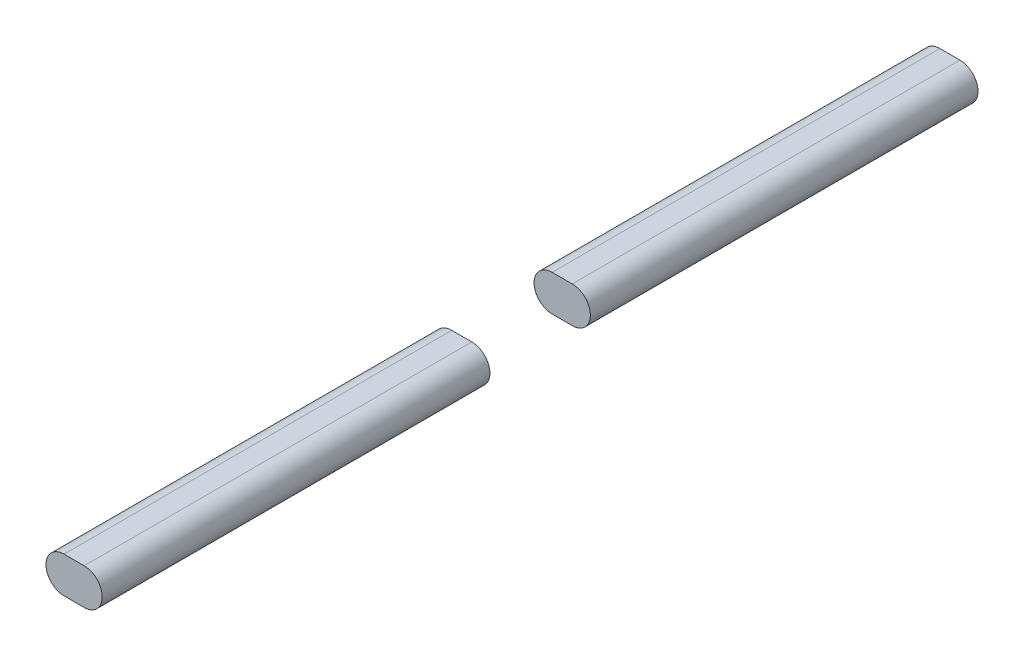
ISO-10303-21;
HEADER;
FILE_DESCRIPTION(('STEP AP214'),'2;1');
FILE_NAME('part.step','',(''),(''),'','','');
FILE_SCHEMA(('AUTOMOTIVE_DESIGN { 1 0 10303 214 1 1 1 1 }'));
ENDSEC;
DATA;
#1=APPLICATION_CONTEXT('core data for automotive mechanical design processes');
#2=APPLICATION_PROTOCOL_DEFINITION('international standard','automotive_design',2000,#1);
#3=PRODUCT_CONTEXT('',#1,'mechanical');
#4=PRODUCT('Part','Part','',(#3));
#5=PRODUCT_RELATED_PRODUCT_CATEGORY('part','',(#4));
#6=PRODUCT_DEFINITION_FORMATION('','',#4);
#7=PRODUCT_DEFINITION_CONTEXT('part definition',#1,'design');
#8=PRODUCT_DEFINITION('design','',#6,#7);
#9=PRODUCT_DEFINITION_SHAPE('','',#8);
#10=(LENGTH_UNIT() NAMED_UNIT(*) SI_UNIT(.MILLI.,.METRE.));
#11=(NAMED_UNIT(*) PLANE_ANGLE_UNIT() SI_UNIT($,.RADIAN.));
#12=(NAMED_UNIT(*) SI_UNIT($,.STERADIAN.) SOLID_ANGLE_UNIT());
#13=UNCERTAINTY_MEASURE_WITH_UNIT(LENGTH_MEASURE(1.E-05),#10,'distance_accuracy_value','');
#14=(GEOMETRIC_REPRESENTATION_CONTEXT(3) GLOBAL_UNCERTAINTY_ASSIGNED_CONTEXT((#13)) GLOBAL_UNIT_ASSIGNED_CONTEXT((#10,
#11,#12)) REPRESENTATION_CONTEXT('',''));
#15=CARTESIAN_POINT('',(0.,0.,0.));
#16=DIRECTION('',(0.,0.,1.));
#17=DIRECTION('',(1.,0.,0.));
#18=AXIS2_PLACEMENT_3D('',#15,#16,#17);
#19=CARTESIAN_POINT('',(-22.75,-4.5,12.5));
#20=DIRECTION('',(0.,0.,1.));
#21=DIRECTION('',(1.,0.,0.));
#22=AXIS2_PLACEMENT_3D('',#19,#20,#21);
#23=PLANE('',#22);
#24=DIRECTION('',(1.,0.,0.));
#25=VECTOR('',#24,1.);
#26=CARTESIAN_POINT('',(-25.25,0.,12.5));
#27=LINE('',#26,#25);
#28=CARTESIAN_POINT('',(-27.75,0.,12.5));
#29=VERTEX_POINT('',#28);
#30=CARTESIAN_POINT('',(-22.75,0.,12.5));
#31=VERTEX_POINT('',#30);
#32=EDGE_CURVE('E87',#29,#31,#27,.T.);
#33=ORIENTED_EDGE('',*,*,#32,.T.);
#34=CARTESIAN_POINT('',(-22.75,-4.5,12.5));
#35=DIRECTION('',(0.,0.,1.));
#36=DIRECTION('',(1.,0.,0.));
#37=AXIS2_PLACEMENT_3D('',#34,#35,#36);
#38=CIRCLE('',#37,4.5);
#39=CARTESIAN_POINT('',(-22.75,-9.,12.5));
#40=VERTEX_POINT('',#39);
#41=EDGE_CURVE('E93',#40,#31,#38,.T.);
#42=ORIENTED_EDGE('',*,*,#41,.F.);
#43=DIRECTION('',(-1.,0.,0.));
#44=VECTOR('',#43,1.);
#45=CARTESIAN_POINT('',(-25.25,-9.,12.5));
#46=LINE('',#45,#44);
#47=CARTESIAN_POINT('',(-27.75,-9.,12.5));
#48=VERTEX_POINT('',#47);
#49=EDGE_CURVE('E99',#40,#48,#46,.T.);
#50=ORIENTED_EDGE('',*,*,#49,.T.);
#51=CARTESIAN_POINT('',(-27.75,-4.5,12.5));
#52=DIRECTION('',(0.,0.,1.));
#53=DIRECTION('',(1.,0.,0.));
#54=AXIS2_PLACEMENT_3D('',#51,#52,#53);
#55=CIRCLE('',#54,4.5);
#56=EDGE_CURVE('E91',#29,#48,#55,.T.);
#57=ORIENTED_EDGE('',*,*,#56,.F.);
#58=EDGE_LOOP('',(#33,#42,#50,#57));
#59=FACE_BOUND('',#58,.T.);
#60=ADVANCED_FACE('F45',(#59),#23,.F.);
#61=CARTESIAN_POINT('',(-22.75,-4.5,125.643316977093));
#62=DIRECTION('',(0.,0.,-1.));
#63=DIRECTION('',(-1.,0.,0.));
#64=AXIS2_PLACEMENT_3D('',#61,#62,#63);
#65=CYLINDRICAL_SURFACE('',#64,4.5);
#66=DIRECTION('',(0.,0.,-1.));
#67=VECTOR('',#66,1.);
#68=CARTESIAN_POINT('',(-22.75,0.,125.643316977093));
#69=LINE('',#68,#67);
#70=CARTESIAN_POINT('',(-22.75,0.,109.));
#71=VERTEX_POINT('',#70);
#72=EDGE_CURVE('E84',#71,#31,#69,.T.);
#73=ORIENTED_EDGE('',*,*,#72,.F.);
#74=CARTESIAN_POINT('',(-22.75,-4.5,109.));
#75=DIRECTION('',(0.,0.,-1.));
#76=DIRECTION('',(-1.,0.,0.));
#77=AXIS2_PLACEMENT_3D('',#74,#75,#76);
#78=CIRCLE('',#77,4.5);
#79=CARTESIAN_POINT('',(-22.75,-9.,109.));
#80=VERTEX_POINT('',#79);
#81=EDGE_CURVE('E49',#71,#80,#78,.T.);
#82=ORIENTED_EDGE('',*,*,#81,.T.);
#83=DIRECTION('',(0.,0.,-1.));
#84=VECTOR('',#83,1.);
#85=CARTESIAN_POINT('',(-22.75,-9.,125.643316977093));
#86=LINE('',#85,#84);
#87=EDGE_CURVE('E90',#80,#40,#86,.T.);
#88=ORIENTED_EDGE('',*,*,#87,.T.);
#89=ORIENTED_EDGE('',*,*,#41,.T.);
#90=EDGE_LOOP('',(#73,#82,#88,#89));
#91=FACE_BOUND('',#90,.T.);
#92=ADVANCED_FACE('F94',(#91),#65,.T.);
#93=CARTESIAN_POINT('',(-25.25,-9.,125.643316977093));
#94=DIRECTION('',(0.,-1.,0.));
#95=DIRECTION('',(1.,0.,0.));
#96=AXIS2_PLACEMENT_3D('',#93,#94,#95);
#97=PLANE('',#96);
#98=DIRECTION('',(1.,0.,0.));
#99=VECTOR('',#98,1.);
#100=CARTESIAN_POINT('',(-25.25,-9.,109.));
#101=LINE('',#100,#99);
#102=CARTESIAN_POINT('',(-27.75,-9.,109.));
#103=VERTEX_POINT('',#102);
#104=EDGE_CURVE('E115',#103,#80,#101,.T.);
#105=ORIENTED_EDGE('',*,*,#104,.F.);
#106=DIRECTION('',(0.,0.,-1.));
#107=VECTOR('',#106,1.);
#108=CARTESIAN_POINT('',(-27.75,-9.,125.643316977093));
#109=LINE('',#108,#107);
#110=EDGE_CURVE('E110',#103,#48,#109,.T.);
#111=ORIENTED_EDGE('',*,*,#110,.T.);
#112=ORIENTED_EDGE('',*,*,#49,.F.);
#113=ORIENTED_EDGE('',*,*,#87,.F.);
#114=EDGE_LOOP('',(#105,#111,#112,#113));
#115=FACE_BOUND('',#114,.T.);
#116=ADVANCED_FACE('F114',(#115),#97,.T.);
#117=CARTESIAN_POINT('',(-27.75,-4.5,125.643316977093));
#118=DIRECTION('',(0.,0.,-1.));
#119=DIRECTION('',(-1.,0.,0.));
#120=AXIS2_PLACEMENT_3D('',#117,#118,#119);
#121=CYLINDRICAL_SURFACE('',#120,4.5);
#122=ORIENTED_EDGE('',*,*,#110,.F.);
#123=CARTESIAN_POINT('',(-27.75,-4.5,109.));
#124=DIRECTION('',(0.,0.,-1.));
#125=DIRECTION('',(-1.,0.,0.));
#126=AXIS2_PLACEMENT_3D('',#123,#124,#125);
#127=CIRCLE('',#126,4.5);
#128=CARTESIAN_POINT('',(-27.75,0.,109.));
#129=VERTEX_POINT('',#128);
#130=EDGE_CURVE('E54',#103,#129,#127,.T.);
#131=ORIENTED_EDGE('',*,*,#130,.T.);
#132=DIRECTION('',(0.,0.,-1.));
#133=VECTOR('',#132,1.);
#134=CARTESIAN_POINT('',(-27.75,0.,125.643316977093));
#135=LINE('',#134,#133);
#136=EDGE_CURVE('E108',#129,#29,#135,.T.);
#137=ORIENTED_EDGE('',*,*,#136,.T.);
#138=ORIENTED_EDGE('',*,*,#56,.T.);
#139=EDGE_LOOP('',(#122,#131,#137,#138));
#140=FACE_BOUND('',#139,.T.);
#141=ADVANCED_FACE('F117',(#140),#121,.T.);
#142=CARTESIAN_POINT('',(-25.25,0.,125.643316977093));
#143=DIRECTION('',(0.,1.,0.));
#144=DIRECTION('',(-1.,0.,0.));
#145=AXIS2_PLACEMENT_3D('',#142,#143,#144);
#146=PLANE('',#145);
#147=DIRECTION('',(-1.,0.,0.));
#148=VECTOR('',#147,1.);
#149=CARTESIAN_POINT('',(-25.25,0.,109.));
#150=LINE('',#149,#148);
#151=EDGE_CURVE('E12',#71,#129,#150,.T.);
#152=ORIENTED_EDGE('',*,*,#151,.F.);
#153=ORIENTED_EDGE('',*,*,#72,.T.);
#154=ORIENTED_EDGE('',*,*,#32,.F.);
#155=ORIENTED_EDGE('',*,*,#136,.F.);
#156=EDGE_LOOP('',(#152,#153,#154,#155));
#157=FACE_BOUND('',#156,.T.);
#158=ADVANCED_FACE('F47',(#157),#146,.T.);
#159=CARTESIAN_POINT('',(0.,-7.08333333333333,109.));
#160=DIRECTION('',(0.,0.,-1.));
#161=DIRECTION('',(-1.,0.,0.));
#162=AXIS2_PLACEMENT_3D('',#159,#160,#161);
#163=PLANE('',#162);
#164=ORIENTED_EDGE('',*,*,#151,.T.);
#165=ORIENTED_EDGE('',*,*,#130,.F.);
#166=ORIENTED_EDGE('',*,*,#104,.T.);
#167=ORIENTED_EDGE('',*,*,#81,.F.);
#168=EDGE_LOOP('',(#164,#165,#166,#167));
#169=FACE_BOUND('',#168,.T.);
#170=ADVANCED_FACE('F119',(#169),#163,.F.);
#171=CLOSED_SHELL('',(#60,#92,#116,#141,#158,#170));
#172=MANIFOLD_SOLID_BREP('B2',#171);
#173=CARTESIAN_POINT('',(-22.75,-4.5,-125.643316977093));
#174=DIRECTION('',(0.,0.,1.));
#175=DIRECTION('',(1.,0.,0.));
#176=AXIS2_PLACEMENT_3D('',#173,#174,#175);
#177=CYLINDRICAL_SURFACE('',#176,4.5);
#178=CARTESIAN_POINT('',(-22.75,-4.5,-109.));
#179=DIRECTION('',(0.,0.,-1.));
#180=DIRECTION('',(-1.,0.,0.));
#181=AXIS2_PLACEMENT_3D('',#178,#179,#180);
#182=CIRCLE('',#181,4.5);
#183=CARTESIAN_POINT('',(-22.75,0.,-109.));
#184=VERTEX_POINT('',#183);
#185=CARTESIAN_POINT('',(-22.75,-9.,-109.));
#186=VERTEX_POINT('',#185);
#187=EDGE_CURVE('E219',#184,#186,#182,.T.);
#188=ORIENTED_EDGE('',*,*,#187,.F.);
#189=DIRECTION('',(0.,0.,1.));
#190=VECTOR('',#189,1.);
#191=CARTESIAN_POINT('',(-22.75,0.,-125.643316977093));
#192=LINE('',#191,#190);
#193=CARTESIAN_POINT('',(-22.75,0.,-12.5));
#194=VERTEX_POINT('',#193);
#195=EDGE_CURVE('E173',#184,#194,#192,.T.);
#196=ORIENTED_EDGE('',*,*,#195,.T.);
#197=CARTESIAN_POINT('',(-22.75,-4.5,-12.5));
#198=DIRECTION('',(0.,0.,-1.));
#199=DIRECTION('',(-1.,0.,0.));
#200=AXIS2_PLACEMENT_3D('',#197,#198,#199);
#201=CIRCLE('',#200,4.5);
#202=CARTESIAN_POINT('',(-22.75,-9.,-12.5));
#203=VERTEX_POINT('',#202);
#204=EDGE_CURVE('E217',#194,#203,#201,.T.);
#205=ORIENTED_EDGE('',*,*,#204,.T.);
#206=DIRECTION('',(0.,0.,1.));
#207=VECTOR('',#206,1.);
#208=CARTESIAN_POINT('',(-22.75,-9.,-125.643316977093));
#209=LINE('',#208,#207);
#210=EDGE_CURVE('E208',#186,#203,#209,.T.);
#211=ORIENTED_EDGE('',*,*,#210,.F.);
#212=EDGE_LOOP('',(#188,#196,#205,#211));
#213=FACE_BOUND('',#212,.T.);
#214=ADVANCED_FACE('F169',(#213),#177,.T.);
#215=CARTESIAN_POINT('',(-25.25,-9.,-125.643316977093));
#216=DIRECTION('',(0.,1.,0.));
#217=DIRECTION('',(-1.,0.,0.));
#218=AXIS2_PLACEMENT_3D('',#215,#216,#217);
#219=PLANE('',#218);
#220=DIRECTION('',(-1.,0.,0.));
#221=VECTOR('',#220,1.);
#222=CARTESIAN_POINT('',(-25.25,-9.,-109.));
#223=LINE('',#222,#221);
#224=CARTESIAN_POINT('',(-27.75,-9.,-109.));
#225=VERTEX_POINT('',#224);
#226=EDGE_CURVE('E178',#186,#225,#223,.T.);
#227=ORIENTED_EDGE('',*,*,#226,.F.);
#228=ORIENTED_EDGE('',*,*,#210,.T.);
#229=DIRECTION('',(-1.,0.,0.));
#230=VECTOR('',#229,1.);
#231=CARTESIAN_POINT('',(-25.25,-9.,-12.5));
#232=LINE('',#231,#230);
#233=CARTESIAN_POINT('',(-27.75,-9.,-12.5));
#234=VERTEX_POINT('',#233);
#235=EDGE_CURVE('E229',#203,#234,#232,.T.);
#236=ORIENTED_EDGE('',*,*,#235,.T.);
#237=DIRECTION('',(0.,0.,1.));
#238=VECTOR('',#237,1.);
#239=CARTESIAN_POINT('',(-27.75,-9.,-125.643316977093));
#240=LINE('',#239,#238);
#241=EDGE_CURVE('E238',#225,#234,#240,.T.);
#242=ORIENTED_EDGE('',*,*,#241,.F.);
#243=EDGE_LOOP('',(#227,#228,#236,#242));
#244=FACE_BOUND('',#243,.T.);
#245=ADVANCED_FACE('F242',(#244),#219,.F.);
#246=CARTESIAN_POINT('',(-27.75,-4.5,-125.643316977093));
#247=DIRECTION('',(0.,0.,1.));
#248=DIRECTION('',(1.,0.,0.));
#249=AXIS2_PLACEMENT_3D('',#246,#247,#248);
#250=CYLINDRICAL_SURFACE('',#249,4.5);
#251=CARTESIAN_POINT('',(-27.75,-4.5,-109.));
#252=DIRECTION('',(0.,0.,-1.));
#253=DIRECTION('',(-1.,0.,0.));
#254=AXIS2_PLACEMENT_3D('',#251,#252,#253);
#255=CIRCLE('',#254,4.5);
#256=CARTESIAN_POINT('',(-27.75,0.,-109.));
#257=VERTEX_POINT('',#256);
#258=EDGE_CURVE('E43',#225,#257,#255,.T.);
#259=ORIENTED_EDGE('',*,*,#258,.F.);
#260=ORIENTED_EDGE('',*,*,#241,.T.);
#261=CARTESIAN_POINT('',(-27.75,-4.5,-12.5));
#262=DIRECTION('',(0.,0.,-1.));
#263=DIRECTION('',(-1.,0.,0.));
#264=AXIS2_PLACEMENT_3D('',#261,#262,#263);
#265=CIRCLE('',#264,4.5);
#266=CARTESIAN_POINT('',(-27.75,0.,-12.5));
#267=VERTEX_POINT('',#266);
#268=EDGE_CURVE('E239',#234,#267,#265,.T.);
#269=ORIENTED_EDGE('',*,*,#268,.T.);
#270=DIRECTION('',(0.,0.,1.));
#271=VECTOR('',#270,1.);
#272=CARTESIAN_POINT('',(-27.75,0.,-125.643316977093));
#273=LINE('',#272,#271);
#274=EDGE_CURVE('E191',#257,#267,#273,.T.);
#275=ORIENTED_EDGE('',*,*,#274,.F.);
#276=EDGE_LOOP('',(#259,#260,#269,#275));
#277=FACE_BOUND('',#276,.T.);
#278=ADVANCED_FACE('F241',(#277),#250,.T.);
#279=CARTESIAN_POINT('',(-25.25,0.,-125.643316977093));
#280=DIRECTION('',(0.,-1.,0.));
#281=DIRECTION('',(1.,0.,0.));
#282=AXIS2_PLACEMENT_3D('',#279,#280,#281);
#283=PLANE('',#282);
#284=DIRECTION('',(1.,0.,0.));
#285=VECTOR('',#284,1.);
#286=CARTESIAN_POINT('',(-25.25,0.,-109.));
#287=LINE('',#286,#285);
#288=EDGE_CURVE('E226',#257,#184,#287,.T.);
#289=ORIENTED_EDGE('',*,*,#288,.F.);
#290=ORIENTED_EDGE('',*,*,#274,.T.);
#291=DIRECTION('',(1.,0.,0.));
#292=VECTOR('',#291,1.);
#293=CARTESIAN_POINT('',(-25.25,0.,-12.5));
#294=LINE('',#293,#292);
#295=EDGE_CURVE('E222',#267,#194,#294,.T.);
#296=ORIENTED_EDGE('',*,*,#295,.T.);
#297=ORIENTED_EDGE('',*,*,#195,.F.);
#298=EDGE_LOOP('',(#289,#290,#296,#297));
#299=FACE_BOUND('',#298,.T.);
#300=ADVANCED_FACE('F223',(#299),#283,.F.);
#301=CARTESIAN_POINT('',(-22.75,-4.5,-12.5));
#302=DIRECTION('',(0.,0.,-1.));
#303=DIRECTION('',(-1.,0.,0.));
#304=AXIS2_PLACEMENT_3D('',#301,#302,#303);
#305=PLANE('',#304);
#306=ORIENTED_EDGE('',*,*,#204,.F.);
#307=ORIENTED_EDGE('',*,*,#295,.F.);
#308=ORIENTED_EDGE('',*,*,#268,.F.);
#309=ORIENTED_EDGE('',*,*,#235,.F.);
#310=EDGE_LOOP('',(#306,#307,#308,#309));
#311=FACE_BOUND('',#310,.T.);
#312=ADVANCED_FACE('F228',(#311),#305,.F.);
#313=CARTESIAN_POINT('',(0.,-7.08333333333333,-109.));
#314=DIRECTION('',(0.,0.,-1.));
#315=DIRECTION('',(-1.,0.,0.));
#316=AXIS2_PLACEMENT_3D('',#313,#314,#315);
#317=PLANE('',#316);
#318=ORIENTED_EDGE('',*,*,#288,.T.);
#319=ORIENTED_EDGE('',*,*,#187,.T.);
#320=ORIENTED_EDGE('',*,*,#226,.T.);
#321=ORIENTED_EDGE('',*,*,#258,.T.);
#322=EDGE_LOOP('',(#318,#319,#320,#321));
#323=FACE_BOUND('',#322,.T.);
#324=ADVANCED_FACE('F171',(#323),#317,.T.);
#325=CLOSED_SHELL('',(#214,#245,#278,#300,#312,#324));
#326=MANIFOLD_SOLID_BREP('B6',#325);
#327=ADVANCED_BREP_SHAPE_REPRESENTATION('',(#18,#172,#326),#14);
#328=SHAPE_DEFINITION_REPRESENTATION(#9,#327);
ENDSEC;
END-ISO-10303-21;
